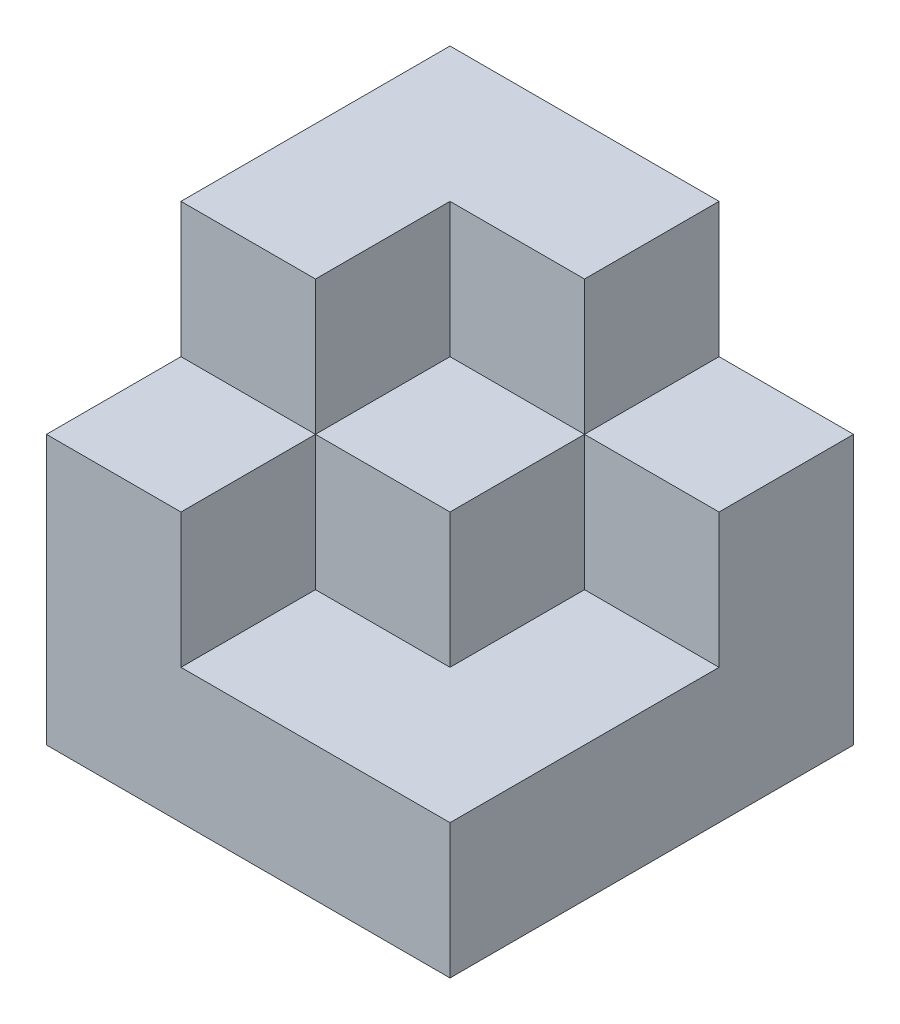
ISO-10303-21;
HEADER;
FILE_DESCRIPTION(('STEP AP214'),'2;1');
FILE_NAME('part.step','',(''),(''),'','','');
FILE_SCHEMA(('AUTOMOTIVE_DESIGN { 1 0 10303 214 1 1 1 1 }'));
ENDSEC;
DATA;
#1=APPLICATION_CONTEXT('core data for automotive mechanical design processes');
#2=APPLICATION_PROTOCOL_DEFINITION('international standard','automotive_design',2000,#1);
#3=PRODUCT_CONTEXT('',#1,'mechanical');
#4=PRODUCT('Part','Part','',(#3));
#5=PRODUCT_RELATED_PRODUCT_CATEGORY('part','',(#4));
#6=PRODUCT_DEFINITION_FORMATION('','',#4);
#7=PRODUCT_DEFINITION_CONTEXT('part definition',#1,'design');
#8=PRODUCT_DEFINITION('design','',#6,#7);
#9=PRODUCT_DEFINITION_SHAPE('','',#8);
#10=(LENGTH_UNIT() NAMED_UNIT(*) SI_UNIT(.MILLI.,.METRE.));
#11=(NAMED_UNIT(*) PLANE_ANGLE_UNIT() SI_UNIT($,.RADIAN.));
#12=(NAMED_UNIT(*) SI_UNIT($,.STERADIAN.) SOLID_ANGLE_UNIT());
#13=UNCERTAINTY_MEASURE_WITH_UNIT(LENGTH_MEASURE(1.E-05),#10,'distance_accuracy_value','');
#14=(GEOMETRIC_REPRESENTATION_CONTEXT(3) GLOBAL_UNCERTAINTY_ASSIGNED_CONTEXT((#13)) GLOBAL_UNIT_ASSIGNED_CONTEXT((#10,
#11,#12)) REPRESENTATION_CONTEXT('',''));
#15=CARTESIAN_POINT('',(0.,0.,0.));
#16=DIRECTION('',(0.,0.,1.));
#17=DIRECTION('',(1.,0.,0.));
#18=AXIS2_PLACEMENT_3D('',#15,#16,#17);
#19=CARTESIAN_POINT('',(0.,20.,0.));
#20=DIRECTION('',(0.,1.,0.));
#21=DIRECTION('',(0.,0.,1.));
#22=AXIS2_PLACEMENT_3D('',#19,#20,#21);
#23=PLANE('',#22);
#24=DIRECTION('',(0.,0.,-1.));
#25=VECTOR('',#24,1.);
#26=CARTESIAN_POINT('',(10.,20.,-9.99999999999999));
#27=LINE('',#26,#25);
#28=CARTESIAN_POINT('',(10.,20.,10.));
#29=VERTEX_POINT('',#28);
#30=CARTESIAN_POINT('',(10.,20.,-9.99999999999999));
#31=VERTEX_POINT('',#30);
#32=EDGE_CURVE('E185',#29,#31,#27,.T.);
#33=ORIENTED_EDGE('',*,*,#32,.F.);
#34=DIRECTION('',(1.,0.,0.));
#35=VECTOR('',#34,1.);
#36=CARTESIAN_POINT('',(-10.,20.,10.));
#37=LINE('',#36,#35);
#38=CARTESIAN_POINT('',(-10.,20.,10.));
#39=VERTEX_POINT('',#38);
#40=EDGE_CURVE('E302',#39,#29,#37,.T.);
#41=ORIENTED_EDGE('',*,*,#40,.F.);
#42=DIRECTION('',(0.,0.,-1.));
#43=VECTOR('',#42,1.);
#44=CARTESIAN_POINT('',(-10.,20.,30.));
#45=LINE('',#44,#43);
#46=CARTESIAN_POINT('',(-10.,20.,30.));
#47=VERTEX_POINT('',#46);
#48=EDGE_CURVE('E90',#47,#39,#45,.T.);
#49=ORIENTED_EDGE('',*,*,#48,.F.);
#50=DIRECTION('',(1.,0.,0.));
#51=VECTOR('',#50,1.);
#52=CARTESIAN_POINT('',(-30.,20.,30.));
#53=LINE('',#52,#51);
#54=CARTESIAN_POINT('',(30.,20.,30.));
#55=VERTEX_POINT('',#54);
#56=EDGE_CURVE('E231',#47,#55,#53,.T.);
#57=ORIENTED_EDGE('',*,*,#56,.T.);
#58=DIRECTION('',(0.,0.,-1.));
#59=VECTOR('',#58,1.);
#60=CARTESIAN_POINT('',(30.,20.,-30.));
#61=LINE('',#60,#59);
#62=CARTESIAN_POINT('',(30.,20.,-9.99999999999998));
#63=VERTEX_POINT('',#62);
#64=EDGE_CURVE('E228',#55,#63,#61,.T.);
#65=ORIENTED_EDGE('',*,*,#64,.T.);
#66=DIRECTION('',(1.,0.,0.));
#67=VECTOR('',#66,1.);
#68=CARTESIAN_POINT('',(-30.,20.,-9.99999999999999));
#69=LINE('',#68,#67);
#70=EDGE_CURVE('E270',#31,#63,#69,.T.);
#71=ORIENTED_EDGE('',*,*,#70,.F.);
#72=EDGE_LOOP('',(#33,#41,#49,#57,#65,#71));
#73=FACE_BOUND('',#72,.T.);
#74=ADVANCED_FACE('F67',(#73),#23,.T.);
#75=CARTESIAN_POINT('',(-10.,40.,30.));
#76=DIRECTION('',(-1.,0.,0.));
#77=DIRECTION('',(0.,0.,1.));
#78=AXIS2_PLACEMENT_3D('',#75,#76,#77);
#79=PLANE('',#78);
#80=DIRECTION('',(0.,-1.,0.));
#81=VECTOR('',#80,1.);
#82=CARTESIAN_POINT('',(-10.,40.,10.));
#83=LINE('',#82,#81);
#84=CARTESIAN_POINT('',(-10.,40.,10.));
#85=VERTEX_POINT('',#84);
#86=EDGE_CURVE('E168',#85,#39,#83,.T.);
#87=ORIENTED_EDGE('',*,*,#86,.F.);
#88=DIRECTION('',(0.,0.,-1.));
#89=VECTOR('',#88,1.);
#90=CARTESIAN_POINT('',(-10.,40.,30.));
#91=LINE('',#90,#89);
#92=CARTESIAN_POINT('',(-10.,40.,30.));
#93=VERTEX_POINT('',#92);
#94=EDGE_CURVE('E193',#93,#85,#91,.T.);
#95=ORIENTED_EDGE('',*,*,#94,.F.);
#96=DIRECTION('',(0.,-1.,0.));
#97=VECTOR('',#96,1.);
#98=CARTESIAN_POINT('',(-10.,40.,30.));
#99=LINE('',#98,#97);
#100=EDGE_CURVE('E209',#93,#47,#99,.T.);
#101=ORIENTED_EDGE('',*,*,#100,.T.);
#102=ORIENTED_EDGE('',*,*,#48,.T.);
#103=EDGE_LOOP('',(#87,#95,#101,#102));
#104=FACE_BOUND('',#103,.T.);
#105=ADVANCED_FACE('F190',(#104),#79,.F.);
#106=CARTESIAN_POINT('',(-30.,60.,-9.99999999999999));
#107=DIRECTION('',(0.,0.,-1.));
#108=DIRECTION('',(-1.,0.,0.));
#109=AXIS2_PLACEMENT_3D('',#106,#107,#108);
#110=PLANE('',#109);
#111=DIRECTION('',(0.,-1.,0.));
#112=VECTOR('',#111,1.);
#113=CARTESIAN_POINT('',(10.,40.,-9.99999999999999));
#114=LINE('',#113,#112);
#115=CARTESIAN_POINT('',(10.,40.,-9.99999999999998));
#116=VERTEX_POINT('',#115);
#117=EDGE_CURVE('E298',#116,#31,#114,.T.);
#118=ORIENTED_EDGE('',*,*,#117,.T.);
#119=ORIENTED_EDGE('',*,*,#70,.T.);
#120=DIRECTION('',(0.,-1.,0.));
#121=VECTOR('',#120,1.);
#122=CARTESIAN_POINT('',(30.,40.,-9.99999999999998));
#123=LINE('',#122,#121);
#124=CARTESIAN_POINT('',(30.,40.,-9.99999999999998));
#125=VERTEX_POINT('',#124);
#126=EDGE_CURVE('E267',#125,#63,#123,.T.);
#127=ORIENTED_EDGE('',*,*,#126,.F.);
#128=DIRECTION('',(1.,0.,0.));
#129=VECTOR('',#128,1.);
#130=CARTESIAN_POINT('',(10.,40.,-9.99999999999998));
#131=LINE('',#130,#129);
#132=EDGE_CURVE('E294',#116,#125,#131,.T.);
#133=ORIENTED_EDGE('',*,*,#132,.F.);
#134=EDGE_LOOP('',(#118,#119,#127,#133));
#135=FACE_BOUND('',#134,.T.);
#136=ADVANCED_FACE('F313',(#135),#110,.F.);
#137=CARTESIAN_POINT('',(30.,20.,-30.));
#138=DIRECTION('',(-1.,0.,0.));
#139=DIRECTION('',(0.,0.,1.));
#140=AXIS2_PLACEMENT_3D('',#137,#138,#139);
#141=PLANE('',#140);
#142=DIRECTION('',(0.,0.,-1.));
#143=VECTOR('',#142,1.);
#144=CARTESIAN_POINT('',(30.,0.,-30.));
#145=LINE('',#144,#143);
#146=CARTESIAN_POINT('',(30.,0.,30.));
#147=VERTEX_POINT('',#146);
#148=CARTESIAN_POINT('',(30.,0.,-30.));
#149=VERTEX_POINT('',#148);
#150=EDGE_CURVE('E227',#147,#149,#145,.T.);
#151=ORIENTED_EDGE('',*,*,#150,.T.);
#152=DIRECTION('',(0.,-1.,0.));
#153=VECTOR('',#152,1.);
#154=CARTESIAN_POINT('',(30.,20.,-30.));
#155=LINE('',#154,#153);
#156=CARTESIAN_POINT('',(30.,40.,-30.));
#157=VERTEX_POINT('',#156);
#158=EDGE_CURVE('E12',#157,#149,#155,.T.);
#159=ORIENTED_EDGE('',*,*,#158,.F.);
#160=DIRECTION('',(0.,0.,-1.));
#161=VECTOR('',#160,1.);
#162=CARTESIAN_POINT('',(30.,40.,-30.));
#163=LINE('',#162,#161);
#164=EDGE_CURVE('E292',#125,#157,#163,.T.);
#165=ORIENTED_EDGE('',*,*,#164,.F.);
#166=ORIENTED_EDGE('',*,*,#126,.T.);
#167=ORIENTED_EDGE('',*,*,#64,.F.);
#168=DIRECTION('',(0.,-1.,0.));
#169=VECTOR('',#168,1.);
#170=CARTESIAN_POINT('',(30.,20.,30.));
#171=LINE('',#170,#169);
#172=EDGE_CURVE('E234',#55,#147,#171,.T.);
#173=ORIENTED_EDGE('',*,*,#172,.T.);
#174=EDGE_LOOP('',(#151,#159,#165,#166,#167,#173));
#175=FACE_BOUND('',#174,.T.);
#176=ADVANCED_FACE('F69',(#175),#141,.F.);
#177=CARTESIAN_POINT('',(-30.,20.,-30.));
#178=DIRECTION('',(0.,0.,1.));
#179=DIRECTION('',(1.,0.,0.));
#180=AXIS2_PLACEMENT_3D('',#177,#178,#179);
#181=PLANE('',#180);
#182=DIRECTION('',(-1.,0.,0.));
#183=VECTOR('',#182,1.);
#184=CARTESIAN_POINT('',(-30.,0.,-30.));
#185=LINE('',#184,#183);
#186=CARTESIAN_POINT('',(-30.,0.,-30.));
#187=VERTEX_POINT('',#186);
#188=EDGE_CURVE('E237',#149,#187,#185,.T.);
#189=ORIENTED_EDGE('',*,*,#188,.T.);
#190=DIRECTION('',(0.,-1.,0.));
#191=VECTOR('',#190,1.);
#192=CARTESIAN_POINT('',(-30.,20.,-30.));
#193=LINE('',#192,#191);
#194=CARTESIAN_POINT('',(-30.,60.,-30.));
#195=VERTEX_POINT('',#194);
#196=EDGE_CURVE('E75',#195,#187,#193,.T.);
#197=ORIENTED_EDGE('',*,*,#196,.F.);
#198=DIRECTION('',(-1.,0.,0.));
#199=VECTOR('',#198,1.);
#200=CARTESIAN_POINT('',(-30.,60.,-30.));
#201=LINE('',#200,#199);
#202=CARTESIAN_POINT('',(10.,60.,-30.));
#203=VERTEX_POINT('',#202);
#204=EDGE_CURVE('E283',#203,#195,#201,.T.);
#205=ORIENTED_EDGE('',*,*,#204,.F.);
#206=DIRECTION('',(0.,-1.,0.));
#207=VECTOR('',#206,1.);
#208=CARTESIAN_POINT('',(10.,60.,-30.));
#209=LINE('',#208,#207);
#210=CARTESIAN_POINT('',(10.,40.,-30.));
#211=VERTEX_POINT('',#210);
#212=EDGE_CURVE('E280',#203,#211,#209,.T.);
#213=ORIENTED_EDGE('',*,*,#212,.T.);
#214=DIRECTION('',(-1.,0.,0.));
#215=VECTOR('',#214,1.);
#216=CARTESIAN_POINT('',(10.,40.,-30.));
#217=LINE('',#216,#215);
#218=EDGE_CURVE('E82',#157,#211,#217,.T.);
#219=ORIENTED_EDGE('',*,*,#218,.F.);
#220=ORIENTED_EDGE('',*,*,#158,.T.);
#221=EDGE_LOOP('',(#189,#197,#205,#213,#219,#220));
#222=FACE_BOUND('',#221,.T.);
#223=ADVANCED_FACE('F320',(#222),#181,.F.);
#224=CARTESIAN_POINT('',(-30.,20.,-30.));
#225=DIRECTION('',(1.,0.,0.));
#226=DIRECTION('',(0.,0.,-1.));
#227=AXIS2_PLACEMENT_3D('',#224,#225,#226);
#228=PLANE('',#227);
#229=DIRECTION('',(0.,0.,1.));
#230=VECTOR('',#229,1.);
#231=CARTESIAN_POINT('',(-30.,0.,-30.));
#232=LINE('',#231,#230);
#233=CARTESIAN_POINT('',(-30.,0.,30.));
#234=VERTEX_POINT('',#233);
#235=EDGE_CURVE('E239',#187,#234,#232,.T.);
#236=ORIENTED_EDGE('',*,*,#235,.T.);
#237=DIRECTION('',(0.,-1.,0.));
#238=VECTOR('',#237,1.);
#239=CARTESIAN_POINT('',(-30.,20.,30.));
#240=LINE('',#239,#238);
#241=CARTESIAN_POINT('',(-30.,40.,30.));
#242=VERTEX_POINT('',#241);
#243=EDGE_CURVE('E244',#242,#234,#240,.T.);
#244=ORIENTED_EDGE('',*,*,#243,.F.);
#245=DIRECTION('',(0.,0.,1.));
#246=VECTOR('',#245,1.);
#247=CARTESIAN_POINT('',(-30.,40.,30.));
#248=LINE('',#247,#246);
#249=CARTESIAN_POINT('',(-30.,40.,10.));
#250=VERTEX_POINT('',#249);
#251=EDGE_CURVE('E220',#250,#242,#248,.T.);
#252=ORIENTED_EDGE('',*,*,#251,.F.);
#253=DIRECTION('',(0.,-1.,0.));
#254=VECTOR('',#253,1.);
#255=CARTESIAN_POINT('',(-30.,60.,9.99999999999998));
#256=LINE('',#255,#254);
#257=CARTESIAN_POINT('',(-30.,60.,9.99999999999998));
#258=VERTEX_POINT('',#257);
#259=EDGE_CURVE('E205',#258,#250,#256,.T.);
#260=ORIENTED_EDGE('',*,*,#259,.F.);
#261=DIRECTION('',(0.,0.,1.));
#262=VECTOR('',#261,1.);
#263=CARTESIAN_POINT('',(-30.,60.,0.));
#264=LINE('',#263,#262);
#265=EDGE_CURVE('E251',#195,#258,#264,.T.);
#266=ORIENTED_EDGE('',*,*,#265,.F.);
#267=ORIENTED_EDGE('',*,*,#196,.T.);
#268=EDGE_LOOP('',(#236,#244,#252,#260,#266,#267));
#269=FACE_BOUND('',#268,.T.);
#270=ADVANCED_FACE('F250',(#269),#228,.F.);
#271=CARTESIAN_POINT('',(-30.,20.,30.));
#272=DIRECTION('',(0.,0.,-1.));
#273=DIRECTION('',(-1.,0.,0.));
#274=AXIS2_PLACEMENT_3D('',#271,#272,#273);
#275=PLANE('',#274);
#276=DIRECTION('',(1.,0.,0.));
#277=VECTOR('',#276,1.);
#278=CARTESIAN_POINT('',(-30.,0.,30.));
#279=LINE('',#278,#277);
#280=EDGE_CURVE('E232',#234,#147,#279,.T.);
#281=ORIENTED_EDGE('',*,*,#280,.T.);
#282=ORIENTED_EDGE('',*,*,#172,.F.);
#283=ORIENTED_EDGE('',*,*,#56,.F.);
#284=ORIENTED_EDGE('',*,*,#100,.F.);
#285=DIRECTION('',(1.,0.,0.));
#286=VECTOR('',#285,1.);
#287=CARTESIAN_POINT('',(-30.,40.,30.));
#288=LINE('',#287,#286);
#289=EDGE_CURVE('E217',#242,#93,#288,.T.);
#290=ORIENTED_EDGE('',*,*,#289,.F.);
#291=ORIENTED_EDGE('',*,*,#243,.T.);
#292=EDGE_LOOP('',(#281,#282,#283,#284,#290,#291));
#293=FACE_BOUND('',#292,.T.);
#294=ADVANCED_FACE('F261',(#293),#275,.F.);
#295=CARTESIAN_POINT('',(0.,0.,0.));
#296=DIRECTION('',(0.,1.,0.));
#297=DIRECTION('',(0.,0.,1.));
#298=AXIS2_PLACEMENT_3D('',#295,#296,#297);
#299=PLANE('',#298);
#300=ORIENTED_EDGE('',*,*,#150,.F.);
#301=ORIENTED_EDGE('',*,*,#280,.F.);
#302=ORIENTED_EDGE('',*,*,#235,.F.);
#303=ORIENTED_EDGE('',*,*,#188,.F.);
#304=EDGE_LOOP('',(#300,#301,#302,#303));
#305=FACE_BOUND('',#304,.T.);
#306=ADVANCED_FACE('F258',(#305),#299,.F.);
#307=DIRECTION('',(0.,-1.,0.));
#308=VECTOR('',#307,1.);
#309=CARTESIAN_POINT('',(-10.,60.,10.));
#310=LINE('',#309,#308);
#311=CARTESIAN_POINT('',(-10.,60.,10.));
#312=VERTEX_POINT('',#311);
#313=EDGE_CURVE('E202',#312,#85,#310,.T.);
#314=ORIENTED_EDGE('',*,*,#313,.T.);
#315=DIRECTION('',(0.,0.,1.));
#316=VECTOR('',#315,1.);
#317=CARTESIAN_POINT('',(-10.,40.,-9.99999999999999));
#318=LINE('',#317,#316);
#319=CARTESIAN_POINT('',(-10.,40.,-9.99999999999999));
#320=VERTEX_POINT('',#319);
#321=EDGE_CURVE('E175',#320,#85,#318,.T.);
#322=ORIENTED_EDGE('',*,*,#321,.F.);
#323=DIRECTION('',(0.,-1.,0.));
#324=VECTOR('',#323,1.);
#325=CARTESIAN_POINT('',(-10.,60.,-9.99999999999999));
#326=LINE('',#325,#324);
#327=CARTESIAN_POINT('',(-10.,60.,-9.99999999999999));
#328=VERTEX_POINT('',#327);
#329=EDGE_CURVE('E225',#328,#320,#326,.T.);
#330=ORIENTED_EDGE('',*,*,#329,.F.);
#331=DIRECTION('',(0.,0.,1.));
#332=VECTOR('',#331,1.);
#333=CARTESIAN_POINT('',(-10.,60.,0.));
#334=LINE('',#333,#332);
#335=EDGE_CURVE('E212',#328,#312,#334,.T.);
#336=ORIENTED_EDGE('',*,*,#335,.T.);
#337=EDGE_LOOP('',(#314,#322,#330,#336));
#338=FACE_BOUND('',#337,.T.);
#339=ADVANCED_FACE('F211',(#338),#79,.F.);
#340=CARTESIAN_POINT('',(0.,40.,0.));
#341=DIRECTION('',(0.,-1.,0.));
#342=DIRECTION('',(0.,0.,-1.));
#343=AXIS2_PLACEMENT_3D('',#340,#341,#342);
#344=PLANE('',#343);
#345=ORIENTED_EDGE('',*,*,#251,.T.);
#346=ORIENTED_EDGE('',*,*,#289,.T.);
#347=ORIENTED_EDGE('',*,*,#94,.T.);
#348=DIRECTION('',(-1.,0.,0.));
#349=VECTOR('',#348,1.);
#350=CARTESIAN_POINT('',(-30.,40.,10.));
#351=LINE('',#350,#349);
#352=EDGE_CURVE('E199',#85,#250,#351,.T.);
#353=ORIENTED_EDGE('',*,*,#352,.T.);
#354=EDGE_LOOP('',(#345,#346,#347,#353));
#355=FACE_BOUND('',#354,.T.);
#356=ADVANCED_FACE('F215',(#355),#344,.F.);
#357=CARTESIAN_POINT('',(0.,60.,10.));
#358=DIRECTION('',(0.,0.,-1.));
#359=DIRECTION('',(-1.,0.,0.));
#360=AXIS2_PLACEMENT_3D('',#357,#358,#359);
#361=PLANE('',#360);
#362=ORIENTED_EDGE('',*,*,#259,.T.);
#363=ORIENTED_EDGE('',*,*,#352,.F.);
#364=ORIENTED_EDGE('',*,*,#313,.F.);
#365=DIRECTION('',(1.,0.,0.));
#366=VECTOR('',#365,1.);
#367=CARTESIAN_POINT('',(0.,60.,10.));
#368=LINE('',#367,#366);
#369=EDGE_CURVE('E213',#258,#312,#368,.T.);
#370=ORIENTED_EDGE('',*,*,#369,.F.);
#371=EDGE_LOOP('',(#362,#363,#364,#370));
#372=FACE_BOUND('',#371,.T.);
#373=ADVANCED_FACE('F200',(#372),#361,.F.);
#374=CARTESIAN_POINT('',(0.,60.,0.));
#375=DIRECTION('',(0.,1.,0.));
#376=DIRECTION('',(0.,0.,1.));
#377=AXIS2_PLACEMENT_3D('',#374,#375,#376);
#378=PLANE('',#377);
#379=ORIENTED_EDGE('',*,*,#335,.F.);
#380=DIRECTION('',(1.,0.,0.));
#381=VECTOR('',#380,1.);
#382=CARTESIAN_POINT('',(-30.,60.,-9.99999999999999));
#383=LINE('',#382,#381);
#384=CARTESIAN_POINT('',(10.,60.,-9.99999999999999));
#385=VERTEX_POINT('',#384);
#386=EDGE_CURVE('E285',#328,#385,#383,.T.);
#387=ORIENTED_EDGE('',*,*,#386,.T.);
#388=DIRECTION('',(0.,0.,-1.));
#389=VECTOR('',#388,1.);
#390=CARTESIAN_POINT('',(10.,60.,-30.));
#391=LINE('',#390,#389);
#392=EDGE_CURVE('E287',#385,#203,#391,.T.);
#393=ORIENTED_EDGE('',*,*,#392,.T.);
#394=ORIENTED_EDGE('',*,*,#204,.T.);
#395=ORIENTED_EDGE('',*,*,#265,.T.);
#396=ORIENTED_EDGE('',*,*,#369,.T.);
#397=EDGE_LOOP('',(#379,#387,#393,#394,#395,#396));
#398=FACE_BOUND('',#397,.T.);
#399=ADVANCED_FACE('F319',(#398),#378,.T.);
#400=ORIENTED_EDGE('',*,*,#329,.T.);
#401=DIRECTION('',(-1.,0.,0.));
#402=VECTOR('',#401,1.);
#403=CARTESIAN_POINT('',(-10.,40.,-9.99999999999999));
#404=LINE('',#403,#402);
#405=EDGE_CURVE('E180',#116,#320,#404,.T.);
#406=ORIENTED_EDGE('',*,*,#405,.F.);
#407=DIRECTION('',(0.,-1.,0.));
#408=VECTOR('',#407,1.);
#409=CARTESIAN_POINT('',(10.,60.,-9.99999999999999));
#410=LINE('',#409,#408);
#411=EDGE_CURVE('E277',#385,#116,#410,.T.);
#412=ORIENTED_EDGE('',*,*,#411,.F.);
#413=ORIENTED_EDGE('',*,*,#386,.F.);
#414=EDGE_LOOP('',(#400,#406,#412,#413));
#415=FACE_BOUND('',#414,.T.);
#416=ADVANCED_FACE('F309',(#415),#110,.F.);
#417=CARTESIAN_POINT('',(10.,60.,-30.));
#418=DIRECTION('',(-1.,0.,0.));
#419=DIRECTION('',(0.,0.,1.));
#420=AXIS2_PLACEMENT_3D('',#417,#418,#419);
#421=PLANE('',#420);
#422=ORIENTED_EDGE('',*,*,#411,.T.);
#423=DIRECTION('',(0.,0.,1.));
#424=VECTOR('',#423,1.);
#425=CARTESIAN_POINT('',(10.,40.,-30.));
#426=LINE('',#425,#424);
#427=EDGE_CURVE('E194',#211,#116,#426,.T.);
#428=ORIENTED_EDGE('',*,*,#427,.F.);
#429=ORIENTED_EDGE('',*,*,#212,.F.);
#430=ORIENTED_EDGE('',*,*,#392,.F.);
#431=EDGE_LOOP('',(#422,#428,#429,#430));
#432=FACE_BOUND('',#431,.T.);
#433=ADVANCED_FACE('F317',(#432),#421,.F.);
#434=CARTESIAN_POINT('',(0.,40.,0.));
#435=DIRECTION('',(0.,1.,0.));
#436=DIRECTION('',(0.,0.,1.));
#437=AXIS2_PLACEMENT_3D('',#434,#435,#436);
#438=PLANE('',#437);
#439=ORIENTED_EDGE('',*,*,#427,.T.);
#440=ORIENTED_EDGE('',*,*,#132,.T.);
#441=ORIENTED_EDGE('',*,*,#164,.T.);
#442=ORIENTED_EDGE('',*,*,#218,.T.);
#443=EDGE_LOOP('',(#439,#440,#441,#442));
#444=FACE_BOUND('',#443,.T.);
#445=ADVANCED_FACE('F314',(#444),#438,.T.);
#446=CARTESIAN_POINT('',(-10.,40.,10.));
#447=DIRECTION('',(0.,0.,-1.));
#448=DIRECTION('',(-1.,0.,0.));
#449=AXIS2_PLACEMENT_3D('',#446,#447,#448);
#450=PLANE('',#449);
#451=ORIENTED_EDGE('',*,*,#40,.T.);
#452=DIRECTION('',(0.,-1.,0.));
#453=VECTOR('',#452,1.);
#454=CARTESIAN_POINT('',(10.,40.,10.));
#455=LINE('',#454,#453);
#456=CARTESIAN_POINT('',(10.,40.,10.));
#457=VERTEX_POINT('',#456);
#458=EDGE_CURVE('E170',#457,#29,#455,.T.);
#459=ORIENTED_EDGE('',*,*,#458,.F.);
#460=DIRECTION('',(1.,0.,0.));
#461=VECTOR('',#460,1.);
#462=CARTESIAN_POINT('',(-10.,40.,10.));
#463=LINE('',#462,#461);
#464=EDGE_CURVE('E164',#85,#457,#463,.T.);
#465=ORIENTED_EDGE('',*,*,#464,.F.);
#466=ORIENTED_EDGE('',*,*,#86,.T.);
#467=EDGE_LOOP('',(#451,#459,#465,#466));
#468=FACE_BOUND('',#467,.T.);
#469=ADVANCED_FACE('F166',(#468),#450,.F.);
#470=CARTESIAN_POINT('',(10.,40.,-9.99999999999999));
#471=DIRECTION('',(-1.,0.,0.));
#472=DIRECTION('',(0.,0.,1.));
#473=AXIS2_PLACEMENT_3D('',#470,#471,#472);
#474=PLANE('',#473);
#475=ORIENTED_EDGE('',*,*,#32,.T.);
#476=ORIENTED_EDGE('',*,*,#117,.F.);
#477=DIRECTION('',(0.,0.,-1.));
#478=VECTOR('',#477,1.);
#479=CARTESIAN_POINT('',(10.,40.,-9.99999999999999));
#480=LINE('',#479,#478);
#481=EDGE_CURVE('E174',#457,#116,#480,.T.);
#482=ORIENTED_EDGE('',*,*,#481,.F.);
#483=ORIENTED_EDGE('',*,*,#458,.T.);
#484=EDGE_LOOP('',(#475,#476,#482,#483));
#485=FACE_BOUND('',#484,.T.);
#486=ADVANCED_FACE('F430',(#485),#474,.F.);
#487=CARTESIAN_POINT('',(0.,40.,0.));
#488=DIRECTION('',(0.,1.,0.));
#489=DIRECTION('',(0.,0.,1.));
#490=AXIS2_PLACEMENT_3D('',#487,#488,#489);
#491=PLANE('',#490);
#492=ORIENTED_EDGE('',*,*,#321,.T.);
#493=ORIENTED_EDGE('',*,*,#464,.T.);
#494=ORIENTED_EDGE('',*,*,#481,.T.);
#495=ORIENTED_EDGE('',*,*,#405,.T.);
#496=EDGE_LOOP('',(#492,#493,#494,#495));
#497=FACE_BOUND('',#496,.T.);
#498=ADVANCED_FACE('F178',(#497),#491,.T.);
#499=CLOSED_SHELL('',(#74,#105,#136,#176,#223,#270,#294,#306,#339,#356,#373,#399,#416,#433,#445,
#469,#486,#498));
#500=MANIFOLD_SOLID_BREP('B2',#499);
#501=ADVANCED_BREP_SHAPE_REPRESENTATION('',(#18,#500),#14);
#502=SHAPE_DEFINITION_REPRESENTATION(#9,#501);
ENDSEC;
END-ISO-10303-21;
